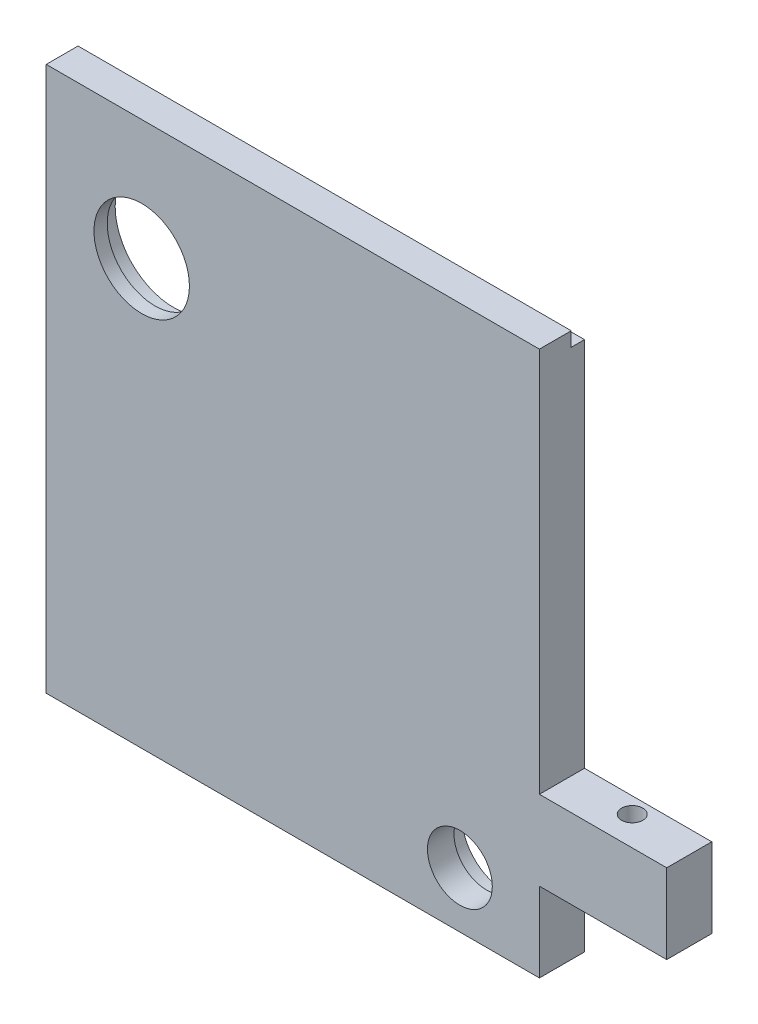
ISO-10303-21;
HEADER;
FILE_DESCRIPTION(('STEP AP214'),'2;1');
FILE_NAME('part.step','',(''),(''),'','','');
FILE_SCHEMA(('AUTOMOTIVE_DESIGN { 1 0 10303 214 1 1 1 1 }'));
ENDSEC;
DATA;
#1=APPLICATION_CONTEXT('core data for automotive mechanical design processes');
#2=APPLICATION_PROTOCOL_DEFINITION('international standard','automotive_design',2000,#1);
#3=PRODUCT_CONTEXT('',#1,'mechanical');
#4=PRODUCT('Part','Part','',(#3));
#5=PRODUCT_RELATED_PRODUCT_CATEGORY('part','',(#4));
#6=PRODUCT_DEFINITION_FORMATION('','',#4);
#7=PRODUCT_DEFINITION_CONTEXT('part definition',#1,'design');
#8=PRODUCT_DEFINITION('design','',#6,#7);
#9=PRODUCT_DEFINITION_SHAPE('','',#8);
#10=(LENGTH_UNIT() NAMED_UNIT(*) SI_UNIT(.MILLI.,.METRE.));
#11=(NAMED_UNIT(*) PLANE_ANGLE_UNIT() SI_UNIT($,.RADIAN.));
#12=(NAMED_UNIT(*) SI_UNIT($,.STERADIAN.) SOLID_ANGLE_UNIT());
#13=UNCERTAINTY_MEASURE_WITH_UNIT(LENGTH_MEASURE(1.E-05),#10,'distance_accuracy_value','');
#14=(GEOMETRIC_REPRESENTATION_CONTEXT(3) GLOBAL_UNCERTAINTY_ASSIGNED_CONTEXT((#13)) GLOBAL_UNIT_ASSIGNED_CONTEXT((#10,
#11,#12)) REPRESENTATION_CONTEXT('',''));
#15=CARTESIAN_POINT('',(0.,0.,0.));
#16=DIRECTION('',(0.,0.,1.));
#17=DIRECTION('',(1.,0.,0.));
#18=AXIS2_PLACEMENT_3D('',#15,#16,#17);
#19=CARTESIAN_POINT('',(1.81294964028777,-24.5719424460432,47.5));
#20=DIRECTION('',(0.,0.,-1.));
#21=DIRECTION('',(-1.,0.,0.));
#22=AXIS2_PLACEMENT_3D('',#19,#20,#21);
#23=CYLINDRICAL_SURFACE('',#22,8.115);
#24=CARTESIAN_POINT('',(1.81294964028777,-24.5719424460432,-2.5));
#25=DIRECTION('',(0.,0.,-1.));
#26=DIRECTION('',(-1.,0.,0.));
#27=AXIS2_PLACEMENT_3D('',#24,#25,#26);
#28=CIRCLE('',#27,8.115);
#29=CARTESIAN_POINT('',(-6.30205035971223,-24.5719424460432,-2.5));
#30=VERTEX_POINT('',#29);
#31=EDGE_CURVE('E309',#30,#30,#28,.T.);
#32=ORIENTED_EDGE('',*,*,#31,.T.);
#33=EDGE_LOOP('',(#32));
#34=FACE_BOUND('',#33,.T.);
#35=CARTESIAN_POINT('',(1.81294964028777,-24.5719424460432,1.));
#36=DIRECTION('',(0.,0.,1.));
#37=DIRECTION('',(1.,0.,0.));
#38=AXIS2_PLACEMENT_3D('',#35,#36,#37);
#39=CIRCLE('',#38,8.115);
#40=CARTESIAN_POINT('',(9.92794964028778,-24.5719424460432,1.));
#41=VERTEX_POINT('',#40);
#42=EDGE_CURVE('E12',#41,#41,#39,.F.);
#43=ORIENTED_EDGE('',*,*,#42,.F.);
#44=EDGE_LOOP('',(#43));
#45=FACE_BOUND('',#44,.T.);
#46=ADVANCED_FACE('F46',(#34,#45),#23,.F.);
#47=CARTESIAN_POINT('',(-58.1870503597123,44.9280575539568,50.));
#48=DIRECTION('',(0.,0.,-1.));
#49=DIRECTION('',(-1.,0.,0.));
#50=AXIS2_PLACEMENT_3D('',#47,#48,#49);
#51=CYLINDRICAL_SURFACE('',#50,11.);
#52=CARTESIAN_POINT('',(-58.1870503597123,44.9280575539568,0.));
#53=DIRECTION('',(0.,0.,-1.));
#54=DIRECTION('',(-1.,0.,0.));
#55=AXIS2_PLACEMENT_3D('',#52,#53,#54);
#56=CIRCLE('',#55,11.);
#57=CARTESIAN_POINT('',(-69.1870503597122,44.9280575539568,0.));
#58=VERTEX_POINT('',#57);
#59=EDGE_CURVE('E312',#58,#58,#56,.T.);
#60=ORIENTED_EDGE('',*,*,#59,.T.);
#61=EDGE_LOOP('',(#60));
#62=FACE_BOUND('',#61,.T.);
#63=CARTESIAN_POINT('',(-58.1870503597123,44.9280575539568,3.5));
#64=DIRECTION('',(0.,0.,1.));
#65=DIRECTION('',(1.,0.,0.));
#66=AXIS2_PLACEMENT_3D('',#63,#64,#65);
#67=CIRCLE('',#66,11.);
#68=CARTESIAN_POINT('',(-47.1870503597123,44.9280575539568,3.5));
#69=VERTEX_POINT('',#68);
#70=EDGE_CURVE('E54',#69,#69,#67,.F.);
#71=ORIENTED_EDGE('',*,*,#70,.F.);
#72=EDGE_LOOP('',(#71));
#73=FACE_BOUND('',#72,.T.);
#74=ADVANCED_FACE('F218',(#62,#73),#51,.F.);
#75=CARTESIAN_POINT('',(16.8129496402878,67.6280575539569,6.));
#76=DIRECTION('',(1.,0.,0.));
#77=DIRECTION('',(0.,1.,0.));
#78=AXIS2_PLACEMENT_3D('',#75,#76,#77);
#79=PLANE('',#78);
#80=DIRECTION('',(0.,0.,1.));
#81=VECTOR('',#80,1.);
#82=CARTESIAN_POINT('',(16.8129496402878,-5.07194244604315,6.));
#83=LINE('',#82,#81);
#84=CARTESIAN_POINT('',(16.8129496402878,-5.07194244604316,-2.5));
#85=VERTEX_POINT('',#84);
#86=CARTESIAN_POINT('',(16.8129496402878,-5.07194244604316,6.));
#87=VERTEX_POINT('',#86);
#88=EDGE_CURVE('E61',#85,#87,#83,.T.);
#89=ORIENTED_EDGE('',*,*,#88,.F.);
#90=DIRECTION('',(0.,-1.,0.));
#91=VECTOR('',#90,1.);
#92=CARTESIAN_POINT('',(16.8129496402878,64.9280575539568,-2.5));
#93=LINE('',#92,#91);
#94=CARTESIAN_POINT('',(16.8129496402878,64.9280575539568,-2.5));
#95=VERTEX_POINT('',#94);
#96=EDGE_CURVE('E164',#95,#85,#93,.T.);
#97=ORIENTED_EDGE('',*,*,#96,.F.);
#98=DIRECTION('',(0.,0.,1.));
#99=VECTOR('',#98,1.);
#100=CARTESIAN_POINT('',(16.8129496402878,64.9280575539568,-2.5));
#101=LINE('',#100,#99);
#102=CARTESIAN_POINT('',(16.8129496402878,64.9280575539568,0.));
#103=VERTEX_POINT('',#102);
#104=EDGE_CURVE('E172',#95,#103,#101,.T.);
#105=ORIENTED_EDGE('',*,*,#104,.T.);
#106=DIRECTION('',(0.,-1.,0.));
#107=VECTOR('',#106,1.);
#108=CARTESIAN_POINT('',(16.8129496402878,67.6280575539569,0.));
#109=LINE('',#108,#107);
#110=CARTESIAN_POINT('',(16.8129496402878,67.6280575539569,0.));
#111=VERTEX_POINT('',#110);
#112=EDGE_CURVE('E201',#111,#103,#109,.T.);
#113=ORIENTED_EDGE('',*,*,#112,.F.);
#114=DIRECTION('',(0.,0.,-1.));
#115=VECTOR('',#114,1.);
#116=CARTESIAN_POINT('',(16.8129496402878,67.6280575539569,6.));
#117=LINE('',#116,#115);
#118=CARTESIAN_POINT('',(16.8129496402878,67.6280575539569,6.));
#119=VERTEX_POINT('',#118);
#120=EDGE_CURVE('E206',#119,#111,#117,.T.);
#121=ORIENTED_EDGE('',*,*,#120,.F.);
#122=DIRECTION('',(0.,-1.,0.));
#123=VECTOR('',#122,1.);
#124=CARTESIAN_POINT('',(16.8129496402878,67.6280575539569,6.));
#125=LINE('',#124,#123);
#126=EDGE_CURVE('E190',#119,#87,#125,.T.);
#127=ORIENTED_EDGE('',*,*,#126,.T.);
#128=EDGE_LOOP('',(#89,#97,#105,#113,#121,#127));
#129=FACE_BOUND('',#128,.T.);
#130=ADVANCED_FACE('F220',(#129),#79,.T.);
#131=CARTESIAN_POINT('',(0.,0.,0.));
#132=DIRECTION('',(0.,0.,1.));
#133=DIRECTION('',(1.,0.,0.));
#134=AXIS2_PLACEMENT_3D('',#131,#132,#133);
#135=PLANE('',#134);
#136=ORIENTED_EDGE('',*,*,#59,.F.);
#137=EDGE_LOOP('',(#136));
#138=FACE_BOUND('',#137,.T.);
#139=DIRECTION('',(1.,0.,0.));
#140=VECTOR('',#139,1.);
#141=CARTESIAN_POINT('',(16.8129496402878,64.9280575539568,0.));
#142=LINE('',#141,#140);
#143=CARTESIAN_POINT('',(-18.1870503597122,64.9280575539568,0.));
#144=VERTEX_POINT('',#143);
#145=EDGE_CURVE('E158',#144,#103,#142,.T.);
#146=ORIENTED_EDGE('',*,*,#145,.F.);
#147=DIRECTION('',(0.,1.,0.));
#148=VECTOR('',#147,1.);
#149=CARTESIAN_POINT('',(-18.1870503597122,64.9280575539568,0.));
#150=LINE('',#149,#148);
#151=CARTESIAN_POINT('',(-18.1870503597123,-35.0719424460432,0.));
#152=VERTEX_POINT('',#151);
#153=EDGE_CURVE('E155',#152,#144,#150,.T.);
#154=ORIENTED_EDGE('',*,*,#153,.F.);
#155=DIRECTION('',(1.,0.,0.));
#156=VECTOR('',#155,1.);
#157=CARTESIAN_POINT('',(-76.1870503597122,-35.0719424460432,0.));
#158=LINE('',#157,#156);
#159=CARTESIAN_POINT('',(-76.1870503597122,-35.0719424460432,0.));
#160=VERTEX_POINT('',#159);
#161=EDGE_CURVE('E198',#160,#152,#158,.T.);
#162=ORIENTED_EDGE('',*,*,#161,.F.);
#163=DIRECTION('',(0.,-1.,0.));
#164=VECTOR('',#163,1.);
#165=CARTESIAN_POINT('',(-76.1870503597122,67.6280575539569,0.));
#166=LINE('',#165,#164);
#167=CARTESIAN_POINT('',(-76.1870503597122,67.6280575539569,0.));
#168=VERTEX_POINT('',#167);
#169=EDGE_CURVE('E184',#168,#160,#166,.T.);
#170=ORIENTED_EDGE('',*,*,#169,.F.);
#171=DIRECTION('',(1.,0.,0.));
#172=VECTOR('',#171,1.);
#173=CARTESIAN_POINT('',(-76.1870503597122,67.6280575539569,0.));
#174=LINE('',#173,#172);
#175=EDGE_CURVE('E188',#168,#111,#174,.T.);
#176=ORIENTED_EDGE('',*,*,#175,.T.);
#177=ORIENTED_EDGE('',*,*,#112,.T.);
#178=EDGE_LOOP('',(#146,#154,#162,#170,#176,#177));
#179=FACE_BOUND('',#178,.T.);
#180=ADVANCED_FACE('F227',(#138,#179),#135,.F.);
#181=CARTESIAN_POINT('',(-76.1870503597122,67.6280575539569,6.));
#182=DIRECTION('',(1.,0.,0.));
#183=DIRECTION('',(0.,1.,0.));
#184=AXIS2_PLACEMENT_3D('',#181,#182,#183);
#185=PLANE('',#184);
#186=ORIENTED_EDGE('',*,*,#169,.T.);
#187=DIRECTION('',(0.,0.,-1.));
#188=VECTOR('',#187,1.);
#189=CARTESIAN_POINT('',(-76.1870503597122,-35.0719424460432,6.));
#190=LINE('',#189,#188);
#191=CARTESIAN_POINT('',(-76.1870503597122,-35.0719424460432,6.));
#192=VERTEX_POINT('',#191);
#193=EDGE_CURVE('E211',#192,#160,#190,.T.);
#194=ORIENTED_EDGE('',*,*,#193,.F.);
#195=DIRECTION('',(0.,-1.,0.));
#196=VECTOR('',#195,1.);
#197=CARTESIAN_POINT('',(-76.1870503597122,67.6280575539569,6.));
#198=LINE('',#197,#196);
#199=CARTESIAN_POINT('',(-76.1870503597122,67.6280575539569,6.));
#200=VERTEX_POINT('',#199);
#201=EDGE_CURVE('E185',#200,#192,#198,.T.);
#202=ORIENTED_EDGE('',*,*,#201,.F.);
#203=DIRECTION('',(0.,0.,-1.));
#204=VECTOR('',#203,1.);
#205=CARTESIAN_POINT('',(-76.1870503597122,67.6280575539569,6.));
#206=LINE('',#205,#204);
#207=EDGE_CURVE('E195',#200,#168,#206,.T.);
#208=ORIENTED_EDGE('',*,*,#207,.T.);
#209=EDGE_LOOP('',(#186,#194,#202,#208));
#210=FACE_BOUND('',#209,.T.);
#211=ADVANCED_FACE('F48',(#210),#185,.F.);
#212=CARTESIAN_POINT('',(-76.1870503597122,-35.0719424460432,6.));
#213=DIRECTION('',(0.,1.,0.));
#214=DIRECTION('',(0.,0.,1.));
#215=AXIS2_PLACEMENT_3D('',#212,#213,#214);
#216=PLANE('',#215);
#217=ORIENTED_EDGE('',*,*,#161,.T.);
#218=DIRECTION('',(0.,0.,1.));
#219=VECTOR('',#218,1.);
#220=CARTESIAN_POINT('',(-18.1870503597123,-35.0719424460432,-2.5));
#221=LINE('',#220,#219);
#222=CARTESIAN_POINT('',(-18.1870503597123,-35.0719424460432,-2.5));
#223=VERTEX_POINT('',#222);
#224=EDGE_CURVE('E181',#223,#152,#221,.T.);
#225=ORIENTED_EDGE('',*,*,#224,.F.);
#226=DIRECTION('',(-1.,0.,0.));
#227=VECTOR('',#226,1.);
#228=CARTESIAN_POINT('',(16.8129496402877,-35.0719424460432,-2.5));
#229=LINE('',#228,#227);
#230=CARTESIAN_POINT('',(16.8129496402877,-35.0719424460432,-2.5));
#231=VERTEX_POINT('',#230);
#232=EDGE_CURVE('E166',#231,#223,#229,.T.);
#233=ORIENTED_EDGE('',*,*,#232,.F.);
#234=DIRECTION('',(0.,0.,-1.));
#235=VECTOR('',#234,1.);
#236=CARTESIAN_POINT('',(16.8129496402878,-35.0719424460432,6.));
#237=LINE('',#236,#235);
#238=CARTESIAN_POINT('',(16.8129496402878,-35.0719424460432,6.));
#239=VERTEX_POINT('',#238);
#240=EDGE_CURVE('E208',#239,#231,#237,.T.);
#241=ORIENTED_EDGE('',*,*,#240,.F.);
#242=DIRECTION('',(1.,0.,0.));
#243=VECTOR('',#242,1.);
#244=CARTESIAN_POINT('',(-76.1870503597122,-35.0719424460432,6.));
#245=LINE('',#244,#243);
#246=EDGE_CURVE('E187',#192,#239,#245,.T.);
#247=ORIENTED_EDGE('',*,*,#246,.F.);
#248=ORIENTED_EDGE('',*,*,#193,.T.);
#249=EDGE_LOOP('',(#217,#225,#233,#241,#247,#248));
#250=FACE_BOUND('',#249,.T.);
#251=ADVANCED_FACE('F270',(#250),#216,.F.);
#252=DIRECTION('',(0.,0.,-1.));
#253=VECTOR('',#252,1.);
#254=CARTESIAN_POINT('',(16.8129496402878,-20.0719424460432,6.));
#255=LINE('',#254,#253);
#256=CARTESIAN_POINT('',(16.8129496402878,-20.0719424460432,6.));
#257=VERTEX_POINT('',#256);
#258=CARTESIAN_POINT('',(16.8129496402878,-20.0719424460432,-2.5));
#259=VERTEX_POINT('',#258);
#260=EDGE_CURVE('E69',#257,#259,#255,.T.);
#261=ORIENTED_EDGE('',*,*,#260,.F.);
#262=EDGE_CURVE('E154',#257,#239,#125,.T.);
#263=ORIENTED_EDGE('',*,*,#262,.T.);
#264=ORIENTED_EDGE('',*,*,#240,.T.);
#265=EDGE_CURVE('E167',#259,#231,#93,.T.);
#266=ORIENTED_EDGE('',*,*,#265,.F.);
#267=EDGE_LOOP('',(#261,#263,#264,#266));
#268=FACE_BOUND('',#267,.T.);
#269=ADVANCED_FACE('F229',(#268),#79,.T.);
#270=CARTESIAN_POINT('',(-76.1870503597122,67.6280575539569,6.));
#271=DIRECTION('',(0.,1.,0.));
#272=DIRECTION('',(0.,0.,1.));
#273=AXIS2_PLACEMENT_3D('',#270,#271,#272);
#274=PLANE('',#273);
#275=ORIENTED_EDGE('',*,*,#175,.F.);
#276=ORIENTED_EDGE('',*,*,#207,.F.);
#277=DIRECTION('',(1.,0.,0.));
#278=VECTOR('',#277,1.);
#279=CARTESIAN_POINT('',(-76.1870503597122,67.6280575539569,6.));
#280=LINE('',#279,#278);
#281=EDGE_CURVE('E192',#200,#119,#280,.T.);
#282=ORIENTED_EDGE('',*,*,#281,.T.);
#283=ORIENTED_EDGE('',*,*,#120,.T.);
#284=EDGE_LOOP('',(#275,#276,#282,#283));
#285=FACE_BOUND('',#284,.T.);
#286=ADVANCED_FACE('F263',(#285),#274,.T.);
#287=CARTESIAN_POINT('',(0.,0.,6.));
#288=DIRECTION('',(0.,0.,1.));
#289=DIRECTION('',(1.,0.,0.));
#290=AXIS2_PLACEMENT_3D('',#287,#288,#289);
#291=PLANE('',#290);
#292=ORIENTED_EDGE('',*,*,#201,.T.);
#293=ORIENTED_EDGE('',*,*,#246,.T.);
#294=ORIENTED_EDGE('',*,*,#262,.F.);
#295=DIRECTION('',(-1.,0.,0.));
#296=VECTOR('',#295,1.);
#297=CARTESIAN_POINT('',(40.8129496402878,-20.0719424460432,6.));
#298=LINE('',#297,#296);
#299=CARTESIAN_POINT('',(40.8129496402878,-20.0719424460432,6.));
#300=VERTEX_POINT('',#299);
#301=EDGE_CURVE('E134',#300,#257,#298,.T.);
#302=ORIENTED_EDGE('',*,*,#301,.F.);
#303=DIRECTION('',(0.,-1.,0.));
#304=VECTOR('',#303,1.);
#305=CARTESIAN_POINT('',(40.8129496402878,-5.07194244604315,6.));
#306=LINE('',#305,#304);
#307=CARTESIAN_POINT('',(40.8129496402878,-5.07194244604315,6.));
#308=VERTEX_POINT('',#307);
#309=EDGE_CURVE('E140',#308,#300,#306,.T.);
#310=ORIENTED_EDGE('',*,*,#309,.F.);
#311=DIRECTION('',(-1.,0.,0.));
#312=VECTOR('',#311,1.);
#313=CARTESIAN_POINT('',(40.8129496402878,-5.07194244604315,6.));
#314=LINE('',#313,#312);
#315=EDGE_CURVE('E296',#308,#87,#314,.T.);
#316=ORIENTED_EDGE('',*,*,#315,.T.);
#317=ORIENTED_EDGE('',*,*,#126,.F.);
#318=ORIENTED_EDGE('',*,*,#281,.F.);
#319=EDGE_LOOP('',(#292,#293,#294,#302,#310,#316,#317,#318));
#320=FACE_BOUND('',#319,.T.);
#321=CARTESIAN_POINT('',(-58.1870503597123,44.9280575539568,6.));
#322=DIRECTION('',(0.,0.,1.));
#323=DIRECTION('',(1.,0.,0.));
#324=AXIS2_PLACEMENT_3D('',#321,#322,#323);
#325=CIRCLE('',#324,8.99999999999999);
#326=CARTESIAN_POINT('',(-49.1870503597123,44.9280575539568,6.));
#327=VERTEX_POINT('',#326);
#328=EDGE_CURVE('E315',#327,#327,#325,.T.);
#329=ORIENTED_EDGE('',*,*,#328,.F.);
#330=EDGE_LOOP('',(#329));
#331=FACE_BOUND('',#330,.T.);
#332=CARTESIAN_POINT('',(1.81294964028777,-24.5719424460432,6.));
#333=DIRECTION('',(0.,0.,1.));
#334=DIRECTION('',(1.,0.,0.));
#335=AXIS2_PLACEMENT_3D('',#332,#333,#334);
#336=CIRCLE('',#335,6.115);
#337=CARTESIAN_POINT('',(7.92794964028778,-24.5719424460432,6.));
#338=VERTEX_POINT('',#337);
#339=EDGE_CURVE('E321',#338,#338,#336,.T.);
#340=ORIENTED_EDGE('',*,*,#339,.F.);
#341=EDGE_LOOP('',(#340));
#342=FACE_BOUND('',#341,.T.);
#343=ADVANCED_FACE('F151',(#320,#331,#342),#291,.T.);
#344=CARTESIAN_POINT('',(-18.1870503597122,64.9280575539568,-2.5));
#345=DIRECTION('',(1.,0.,0.));
#346=DIRECTION('',(0.,1.,0.));
#347=AXIS2_PLACEMENT_3D('',#344,#345,#346);
#348=PLANE('',#347);
#349=ORIENTED_EDGE('',*,*,#153,.T.);
#350=DIRECTION('',(0.,0.,1.));
#351=VECTOR('',#350,1.);
#352=CARTESIAN_POINT('',(-18.1870503597122,64.9280575539568,-2.5));
#353=LINE('',#352,#351);
#354=CARTESIAN_POINT('',(-18.1870503597122,64.9280575539568,-2.5));
#355=VERTEX_POINT('',#354);
#356=EDGE_CURVE('E178',#355,#144,#353,.T.);
#357=ORIENTED_EDGE('',*,*,#356,.F.);
#358=DIRECTION('',(0.,1.,0.));
#359=VECTOR('',#358,1.);
#360=CARTESIAN_POINT('',(-18.1870503597122,64.9280575539568,-2.5));
#361=LINE('',#360,#359);
#362=EDGE_CURVE('E169',#223,#355,#361,.T.);
#363=ORIENTED_EDGE('',*,*,#362,.F.);
#364=ORIENTED_EDGE('',*,*,#224,.T.);
#365=EDGE_LOOP('',(#349,#357,#363,#364));
#366=FACE_BOUND('',#365,.T.);
#367=ADVANCED_FACE('F256',(#366),#348,.F.);
#368=CARTESIAN_POINT('',(16.8129496402878,64.9280575539568,-2.5));
#369=DIRECTION('',(0.,-1.,0.));
#370=DIRECTION('',(0.,0.,-1.));
#371=AXIS2_PLACEMENT_3D('',#368,#369,#370);
#372=PLANE('',#371);
#373=ORIENTED_EDGE('',*,*,#145,.T.);
#374=ORIENTED_EDGE('',*,*,#104,.F.);
#375=DIRECTION('',(1.,0.,0.));
#376=VECTOR('',#375,1.);
#377=CARTESIAN_POINT('',(16.8129496402878,64.9280575539568,-2.5));
#378=LINE('',#377,#376);
#379=EDGE_CURVE('E171',#355,#95,#378,.T.);
#380=ORIENTED_EDGE('',*,*,#379,.F.);
#381=ORIENTED_EDGE('',*,*,#356,.T.);
#382=EDGE_LOOP('',(#373,#374,#380,#381));
#383=FACE_BOUND('',#382,.T.);
#384=ADVANCED_FACE('F252',(#383),#372,.F.);
#385=CARTESIAN_POINT('',(0.,0.,-2.5));
#386=DIRECTION('',(0.,0.,-1.));
#387=DIRECTION('',(-1.,0.,0.));
#388=AXIS2_PLACEMENT_3D('',#385,#386,#387);
#389=PLANE('',#388);
#390=ORIENTED_EDGE('',*,*,#31,.F.);
#391=EDGE_LOOP('',(#390));
#392=FACE_BOUND('',#391,.T.);
#393=ORIENTED_EDGE('',*,*,#96,.T.);
#394=DIRECTION('',(-1.,0.,0.));
#395=VECTOR('',#394,1.);
#396=CARTESIAN_POINT('',(40.8129496402878,-5.07194244604315,-2.5));
#397=LINE('',#396,#395);
#398=CARTESIAN_POINT('',(40.8129496402878,-5.07194244604315,-2.5));
#399=VERTEX_POINT('',#398);
#400=EDGE_CURVE('E160',#399,#85,#397,.T.);
#401=ORIENTED_EDGE('',*,*,#400,.F.);
#402=DIRECTION('',(0.,1.,0.));
#403=VECTOR('',#402,1.);
#404=CARTESIAN_POINT('',(40.8129496402878,-5.07194244604315,-2.5));
#405=LINE('',#404,#403);
#406=CARTESIAN_POINT('',(40.8129496402878,-20.0719424460432,-2.5));
#407=VERTEX_POINT('',#406);
#408=EDGE_CURVE('E139',#407,#399,#405,.T.);
#409=ORIENTED_EDGE('',*,*,#408,.F.);
#410=DIRECTION('',(-1.,0.,0.));
#411=VECTOR('',#410,1.);
#412=CARTESIAN_POINT('',(40.8129496402878,-20.0719424460432,-2.5));
#413=LINE('',#412,#411);
#414=EDGE_CURVE('E136',#407,#259,#413,.T.);
#415=ORIENTED_EDGE('',*,*,#414,.T.);
#416=ORIENTED_EDGE('',*,*,#265,.T.);
#417=ORIENTED_EDGE('',*,*,#232,.T.);
#418=ORIENTED_EDGE('',*,*,#362,.T.);
#419=ORIENTED_EDGE('',*,*,#379,.T.);
#420=EDGE_LOOP('',(#393,#401,#409,#415,#416,#417,#418,#419));
#421=FACE_BOUND('',#420,.T.);
#422=ADVANCED_FACE('F248',(#392,#421),#389,.T.);
#423=CARTESIAN_POINT('',(40.8129496402878,-20.0719424460432,6.));
#424=DIRECTION('',(0.,1.,0.));
#425=DIRECTION('',(-1.,0.,0.));
#426=AXIS2_PLACEMENT_3D('',#423,#424,#425);
#427=PLANE('',#426);
#428=CARTESIAN_POINT('',(28.8129496402878,-20.0719424460432,0.5));
#429=DIRECTION('',(0.,1.,0.));
#430=DIRECTION('',(-1.,0.,0.));
#431=AXIS2_PLACEMENT_3D('',#428,#429,#430);
#432=CIRCLE('',#431,2.);
#433=CARTESIAN_POINT('',(26.8129496402878,-20.0719424460432,0.5));
#434=VERTEX_POINT('',#433);
#435=EDGE_CURVE('E301',#434,#434,#432,.T.);
#436=ORIENTED_EDGE('',*,*,#435,.T.);
#437=EDGE_LOOP('',(#436));
#438=FACE_BOUND('',#437,.T.);
#439=ORIENTED_EDGE('',*,*,#260,.T.);
#440=ORIENTED_EDGE('',*,*,#414,.F.);
#441=DIRECTION('',(0.,0.,-1.));
#442=VECTOR('',#441,1.);
#443=CARTESIAN_POINT('',(40.8129496402878,-20.0719424460432,6.));
#444=LINE('',#443,#442);
#445=EDGE_CURVE('E130',#300,#407,#444,.T.);
#446=ORIENTED_EDGE('',*,*,#445,.F.);
#447=ORIENTED_EDGE('',*,*,#301,.T.);
#448=EDGE_LOOP('',(#439,#440,#446,#447));
#449=FACE_BOUND('',#448,.T.);
#450=ADVANCED_FACE('F132',(#438,#449),#427,.F.);
#451=CARTESIAN_POINT('',(40.8129496402878,-5.07194244604315,6.));
#452=DIRECTION('',(0.,-1.,0.));
#453=DIRECTION('',(1.,0.,0.));
#454=AXIS2_PLACEMENT_3D('',#451,#452,#453);
#455=PLANE('',#454);
#456=CARTESIAN_POINT('',(28.8129496402878,-5.07194244604315,0.5));
#457=DIRECTION('',(0.,1.,0.));
#458=DIRECTION('',(-1.,0.,0.));
#459=AXIS2_PLACEMENT_3D('',#456,#457,#458);
#460=CIRCLE('',#459,2.);
#461=CARTESIAN_POINT('',(26.8129496402878,-5.07194244604315,0.5));
#462=VERTEX_POINT('',#461);
#463=EDGE_CURVE('E306',#462,#462,#460,.T.);
#464=ORIENTED_EDGE('',*,*,#463,.F.);
#465=EDGE_LOOP('',(#464));
#466=FACE_BOUND('',#465,.T.);
#467=ORIENTED_EDGE('',*,*,#88,.T.);
#468=ORIENTED_EDGE('',*,*,#315,.F.);
#469=DIRECTION('',(0.,0.,1.));
#470=VECTOR('',#469,1.);
#471=CARTESIAN_POINT('',(40.8129496402878,-5.07194244604315,6.));
#472=LINE('',#471,#470);
#473=EDGE_CURVE('E145',#399,#308,#472,.T.);
#474=ORIENTED_EDGE('',*,*,#473,.F.);
#475=ORIENTED_EDGE('',*,*,#400,.T.);
#476=EDGE_LOOP('',(#467,#468,#474,#475));
#477=FACE_BOUND('',#476,.T.);
#478=ADVANCED_FACE('F242',(#466,#477),#455,.F.);
#479=CARTESIAN_POINT('',(40.8129496402878,0.,0.));
#480=DIRECTION('',(1.,0.,0.));
#481=DIRECTION('',(0.,0.,-1.));
#482=AXIS2_PLACEMENT_3D('',#479,#480,#481);
#483=PLANE('',#482);
#484=ORIENTED_EDGE('',*,*,#309,.T.);
#485=ORIENTED_EDGE('',*,*,#445,.T.);
#486=ORIENTED_EDGE('',*,*,#408,.T.);
#487=ORIENTED_EDGE('',*,*,#473,.T.);
#488=EDGE_LOOP('',(#484,#485,#486,#487));
#489=FACE_BOUND('',#488,.T.);
#490=ADVANCED_FACE('F143',(#489),#483,.T.);
#491=CARTESIAN_POINT('',(28.8129496402878,-55.0719424460432,0.5));
#492=DIRECTION('',(0.,1.,0.));
#493=DIRECTION('',(-1.,0.,0.));
#494=AXIS2_PLACEMENT_3D('',#491,#492,#493);
#495=CYLINDRICAL_SURFACE('',#494,2.);
#496=ORIENTED_EDGE('',*,*,#463,.T.);
#497=EDGE_LOOP('',(#496));
#498=FACE_BOUND('',#497,.T.);
#499=ORIENTED_EDGE('',*,*,#435,.F.);
#500=EDGE_LOOP('',(#499));
#501=FACE_BOUND('',#500,.T.);
#502=ADVANCED_FACE('F236',(#498,#501),#495,.F.);
#503=CARTESIAN_POINT('',(-58.1870503597123,44.9280575539568,3.5));
#504=DIRECTION('',(0.,0.,1.));
#505=DIRECTION('',(1.,0.,0.));
#506=AXIS2_PLACEMENT_3D('',#503,#504,#505);
#507=PLANE('',#506);
#508=CARTESIAN_POINT('',(-58.1870503597123,44.9280575539568,3.5));
#509=DIRECTION('',(0.,0.,1.));
#510=DIRECTION('',(1.,0.,0.));
#511=AXIS2_PLACEMENT_3D('',#508,#509,#510);
#512=CIRCLE('',#511,8.99999999999999);
#513=CARTESIAN_POINT('',(-49.1870503597123,44.9280575539568,3.5));
#514=VERTEX_POINT('',#513);
#515=EDGE_CURVE('E314',#514,#514,#512,.T.);
#516=ORIENTED_EDGE('',*,*,#515,.T.);
#517=EDGE_LOOP('',(#516));
#518=FACE_BOUND('',#517,.T.);
#519=ORIENTED_EDGE('',*,*,#70,.T.);
#520=EDGE_LOOP('',(#519));
#521=FACE_BOUND('',#520,.T.);
#522=ADVANCED_FACE('F216',(#518,#521),#507,.F.);
#523=CARTESIAN_POINT('',(-58.1870503597123,44.9280575539568,3.5));
#524=DIRECTION('',(0.,0.,1.));
#525=DIRECTION('',(1.,0.,0.));
#526=AXIS2_PLACEMENT_3D('',#523,#524,#525);
#527=CYLINDRICAL_SURFACE('',#526,8.99999999999999);
#528=ORIENTED_EDGE('',*,*,#515,.F.);
#529=EDGE_LOOP('',(#528));
#530=FACE_BOUND('',#529,.T.);
#531=ORIENTED_EDGE('',*,*,#328,.T.);
#532=EDGE_LOOP('',(#531));
#533=FACE_BOUND('',#532,.T.);
#534=ADVANCED_FACE('F339',(#530,#533),#527,.F.);
#535=CARTESIAN_POINT('',(1.81294964028777,-24.5719424460432,1.));
#536=DIRECTION('',(0.,0.,1.));
#537=DIRECTION('',(1.,0.,0.));
#538=AXIS2_PLACEMENT_3D('',#535,#536,#537);
#539=PLANE('',#538);
#540=CARTESIAN_POINT('',(1.81294964028777,-24.5719424460432,1.));
#541=DIRECTION('',(0.,0.,1.));
#542=DIRECTION('',(1.,0.,0.));
#543=AXIS2_PLACEMENT_3D('',#540,#541,#542);
#544=CIRCLE('',#543,6.115);
#545=CARTESIAN_POINT('',(7.92794964028778,-24.5719424460432,1.));
#546=VERTEX_POINT('',#545);
#547=EDGE_CURVE('E318',#546,#546,#544,.T.);
#548=ORIENTED_EDGE('',*,*,#547,.T.);
#549=EDGE_LOOP('',(#548));
#550=FACE_BOUND('',#549,.T.);
#551=ORIENTED_EDGE('',*,*,#42,.T.);
#552=EDGE_LOOP('',(#551));
#553=FACE_BOUND('',#552,.T.);
#554=ADVANCED_FACE('F327',(#550,#553),#539,.F.);
#555=CARTESIAN_POINT('',(1.81294964028777,-24.5719424460432,1.));
#556=DIRECTION('',(0.,0.,1.));
#557=DIRECTION('',(1.,0.,0.));
#558=AXIS2_PLACEMENT_3D('',#555,#556,#557);
#559=CYLINDRICAL_SURFACE('',#558,6.115);
#560=ORIENTED_EDGE('',*,*,#547,.F.);
#561=EDGE_LOOP('',(#560));
#562=FACE_BOUND('',#561,.T.);
#563=ORIENTED_EDGE('',*,*,#339,.T.);
#564=EDGE_LOOP('',(#563));
#565=FACE_BOUND('',#564,.T.);
#566=ADVANCED_FACE('F330',(#562,#565),#559,.F.);
#567=CLOSED_SHELL('',(#46,#74,#130,#180,#211,#251,#269,#286,#343,#367,#384,#422,#450,#478,#490,
#502,#522,#534,#554,#566));
#568=MANIFOLD_SOLID_BREP('B2',#567);
#569=ADVANCED_BREP_SHAPE_REPRESENTATION('',(#18,#568),#14);
#570=SHAPE_DEFINITION_REPRESENTATION(#9,#569);
ENDSEC;
END-ISO-10303-21;
